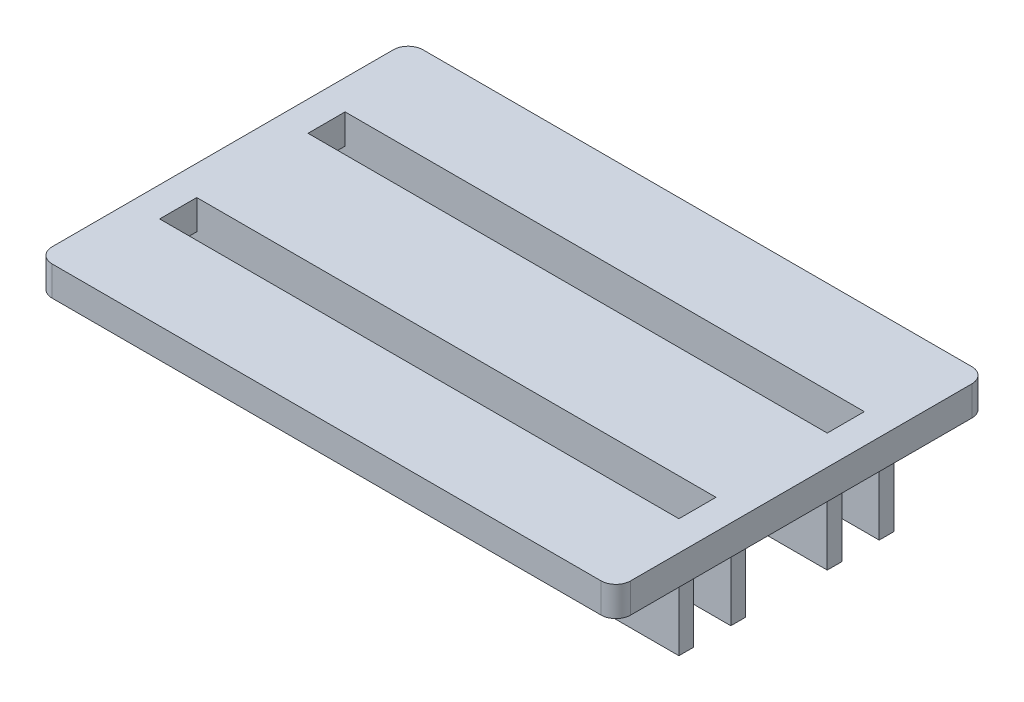
ISO-10303-21;
HEADER;
FILE_DESCRIPTION(('STEP AP214'),'2;1');
FILE_NAME('part.step','',(''),(''),'','','');
FILE_SCHEMA(('AUTOMOTIVE_DESIGN { 1 0 10303 214 1 1 1 1 }'));
ENDSEC;
DATA;
#1=APPLICATION_CONTEXT('core data for automotive mechanical design processes');
#2=APPLICATION_PROTOCOL_DEFINITION('international standard','automotive_design',2000,#1);
#3=PRODUCT_CONTEXT('',#1,'mechanical');
#4=PRODUCT('Part','Part','',(#3));
#5=PRODUCT_RELATED_PRODUCT_CATEGORY('part','',(#4));
#6=PRODUCT_DEFINITION_FORMATION('','',#4);
#7=PRODUCT_DEFINITION_CONTEXT('part definition',#1,'design');
#8=PRODUCT_DEFINITION('design','',#6,#7);
#9=PRODUCT_DEFINITION_SHAPE('','',#8);
#10=(LENGTH_UNIT() NAMED_UNIT(*) SI_UNIT(.MILLI.,.METRE.));
#11=(NAMED_UNIT(*) PLANE_ANGLE_UNIT() SI_UNIT($,.RADIAN.));
#12=(NAMED_UNIT(*) SI_UNIT($,.STERADIAN.) SOLID_ANGLE_UNIT());
#13=UNCERTAINTY_MEASURE_WITH_UNIT(LENGTH_MEASURE(1.E-05),#10,'distance_accuracy_value','');
#14=(GEOMETRIC_REPRESENTATION_CONTEXT(3) GLOBAL_UNCERTAINTY_ASSIGNED_CONTEXT((#13)) GLOBAL_UNIT_ASSIGNED_CONTEXT((#10,
#11,#12)) REPRESENTATION_CONTEXT('',''));
#15=CARTESIAN_POINT('',(0.,0.,0.));
#16=DIRECTION('',(0.,0.,1.));
#17=DIRECTION('',(1.,0.,0.));
#18=AXIS2_PLACEMENT_3D('',#15,#16,#17);
#19=CARTESIAN_POINT('',(46.99,0.,29.21));
#20=DIRECTION('',(0.,1.,0.));
#21=DIRECTION('',(0.,0.,1.));
#22=AXIS2_PLACEMENT_3D('',#19,#20,#21);
#23=PLANE('',#22);
#24=CARTESIAN_POINT('',(46.99,0.,29.21));
#25=DIRECTION('',(0.,1.,0.));
#26=DIRECTION('',(0.,0.,1.));
#27=AXIS2_PLACEMENT_3D('',#24,#25,#26);
#28=CIRCLE('',#27,2.54);
#29=CARTESIAN_POINT('',(46.99,0.,31.75));
#30=VERTEX_POINT('',#29);
#31=CARTESIAN_POINT('',(49.53,0.,29.21));
#32=VERTEX_POINT('',#31);
#33=EDGE_CURVE('E466',#30,#32,#28,.T.);
#34=ORIENTED_EDGE('',*,*,#33,.F.);
#35=DIRECTION('',(1.,0.,0.));
#36=VECTOR('',#35,1.);
#37=CARTESIAN_POINT('',(-46.99,0.,31.75));
#38=LINE('',#37,#36);
#39=CARTESIAN_POINT('',(-46.99,0.,31.75));
#40=VERTEX_POINT('',#39);
#41=EDGE_CURVE('E523',#40,#30,#38,.T.);
#42=ORIENTED_EDGE('',*,*,#41,.F.);
#43=CARTESIAN_POINT('',(-46.99,0.,29.21));
#44=DIRECTION('',(0.,1.,0.));
#45=DIRECTION('',(0.,0.,1.));
#46=AXIS2_PLACEMENT_3D('',#43,#44,#45);
#47=CIRCLE('',#46,2.54);
#48=CARTESIAN_POINT('',(-49.53,0.,29.21));
#49=VERTEX_POINT('',#48);
#50=EDGE_CURVE('E557',#49,#40,#47,.T.);
#51=ORIENTED_EDGE('',*,*,#50,.F.);
#52=DIRECTION('',(0.,0.,1.));
#53=VECTOR('',#52,1.);
#54=CARTESIAN_POINT('',(-49.53,0.,-29.21));
#55=LINE('',#54,#53);
#56=CARTESIAN_POINT('',(-49.53,0.,-29.21));
#57=VERTEX_POINT('',#56);
#58=EDGE_CURVE('E554',#57,#49,#55,.T.);
#59=ORIENTED_EDGE('',*,*,#58,.F.);
#60=CARTESIAN_POINT('',(-46.99,0.,-29.21));
#61=DIRECTION('',(0.,1.,0.));
#62=DIRECTION('',(0.,0.,1.));
#63=AXIS2_PLACEMENT_3D('',#60,#61,#62);
#64=CIRCLE('',#63,2.54);
#65=CARTESIAN_POINT('',(-46.99,0.,-31.75));
#66=VERTEX_POINT('',#65);
#67=EDGE_CURVE('E552',#66,#57,#64,.T.);
#68=ORIENTED_EDGE('',*,*,#67,.F.);
#69=DIRECTION('',(-1.,0.,0.));
#70=VECTOR('',#69,1.);
#71=CARTESIAN_POINT('',(-46.99,0.,-31.75));
#72=LINE('',#71,#70);
#73=CARTESIAN_POINT('',(46.99,0.,-31.75));
#74=VERTEX_POINT('',#73);
#75=EDGE_CURVE('E550',#74,#66,#72,.T.);
#76=ORIENTED_EDGE('',*,*,#75,.F.);
#77=CARTESIAN_POINT('',(46.99,0.,-29.21));
#78=DIRECTION('',(0.,1.,0.));
#79=DIRECTION('',(0.,0.,-1.));
#80=AXIS2_PLACEMENT_3D('',#77,#78,#79);
#81=CIRCLE('',#80,2.54);
#82=CARTESIAN_POINT('',(49.53,0.,-29.21));
#83=VERTEX_POINT('',#82);
#84=EDGE_CURVE('E548',#83,#74,#81,.T.);
#85=ORIENTED_EDGE('',*,*,#84,.F.);
#86=DIRECTION('',(0.,0.,-1.));
#87=VECTOR('',#86,1.);
#88=CARTESIAN_POINT('',(49.53,0.,-29.21));
#89=LINE('',#88,#87);
#90=EDGE_CURVE('E545',#32,#83,#89,.T.);
#91=ORIENTED_EDGE('',*,*,#90,.F.);
#92=EDGE_LOOP('',(#34,#42,#51,#59,#68,#76,#85,#91));
#93=FACE_BOUND('',#92,.T.);
#94=DIRECTION('',(-1.,0.,0.));
#95=VECTOR('',#94,1.);
#96=CARTESIAN_POINT('',(46.99,0.,9.525));
#97=LINE('',#96,#95);
#98=CARTESIAN_POINT('',(46.99,0.,9.525));
#99=VERTEX_POINT('',#98);
#100=CARTESIAN_POINT('',(44.45,0.,9.525));
#101=VERTEX_POINT('',#100);
#102=EDGE_CURVE('E411',#99,#101,#97,.T.);
#103=ORIENTED_EDGE('',*,*,#102,.F.);
#104=DIRECTION('',(0.,0.,1.));
#105=VECTOR('',#104,1.);
#106=CARTESIAN_POINT('',(46.99,0.,6.985));
#107=LINE('',#106,#105);
#108=CARTESIAN_POINT('',(46.99,0.,6.985));
#109=VERTEX_POINT('',#108);
#110=EDGE_CURVE('E374',#109,#99,#107,.T.);
#111=ORIENTED_EDGE('',*,*,#110,.F.);
#112=DIRECTION('',(-1.,0.,0.));
#113=VECTOR('',#112,1.);
#114=CARTESIAN_POINT('',(46.99,0.,6.985));
#115=LINE('',#114,#113);
#116=CARTESIAN_POINT('',(-46.99,0.,6.985));
#117=VERTEX_POINT('',#116);
#118=EDGE_CURVE('E388',#109,#117,#115,.T.);
#119=ORIENTED_EDGE('',*,*,#118,.T.);
#120=DIRECTION('',(0.,0.,1.));
#121=VECTOR('',#120,1.);
#122=CARTESIAN_POINT('',(-46.99,0.,6.985));
#123=LINE('',#122,#121);
#124=CARTESIAN_POINT('',(-46.99,0.,9.525));
#125=VERTEX_POINT('',#124);
#126=EDGE_CURVE('E373',#117,#125,#123,.T.);
#127=ORIENTED_EDGE('',*,*,#126,.T.);
#128=CARTESIAN_POINT('',(-44.45,0.,9.525));
#129=VERTEX_POINT('',#128);
#130=EDGE_CURVE('E410',#129,#125,#97,.T.);
#131=ORIENTED_EDGE('',*,*,#130,.F.);
#132=DIRECTION('',(0.,0.,1.));
#133=VECTOR('',#132,1.);
#134=CARTESIAN_POINT('',(-44.45,0.,15.875));
#135=LINE('',#134,#133);
#136=CARTESIAN_POINT('',(-44.45,0.,15.875));
#137=VERTEX_POINT('',#136);
#138=EDGE_CURVE('E489',#129,#137,#135,.T.);
#139=ORIENTED_EDGE('',*,*,#138,.T.);
#140=DIRECTION('',(-1.,0.,0.));
#141=VECTOR('',#140,1.);
#142=CARTESIAN_POINT('',(46.99,0.,15.875));
#143=LINE('',#142,#141);
#144=CARTESIAN_POINT('',(-46.99,0.,15.875));
#145=VERTEX_POINT('',#144);
#146=EDGE_CURVE('E11',#137,#145,#143,.T.);
#147=ORIENTED_EDGE('',*,*,#146,.T.);
#148=DIRECTION('',(0.,0.,1.));
#149=VECTOR('',#148,1.);
#150=CARTESIAN_POINT('',(-46.99,0.,18.415));
#151=LINE('',#150,#149);
#152=CARTESIAN_POINT('',(-46.99,0.,18.415));
#153=VERTEX_POINT('',#152);
#154=EDGE_CURVE('E415',#145,#153,#151,.T.);
#155=ORIENTED_EDGE('',*,*,#154,.T.);
#156=DIRECTION('',(-1.,0.,0.));
#157=VECTOR('',#156,1.);
#158=CARTESIAN_POINT('',(46.99,0.,18.415));
#159=LINE('',#158,#157);
#160=CARTESIAN_POINT('',(46.99,0.,18.415));
#161=VERTEX_POINT('',#160);
#162=EDGE_CURVE('E450',#161,#153,#159,.T.);
#163=ORIENTED_EDGE('',*,*,#162,.F.);
#164=DIRECTION('',(0.,0.,1.));
#165=VECTOR('',#164,1.);
#166=CARTESIAN_POINT('',(46.99,0.,18.415));
#167=LINE('',#166,#165);
#168=CARTESIAN_POINT('',(46.99,0.,15.875));
#169=VERTEX_POINT('',#168);
#170=EDGE_CURVE('E416',#169,#161,#167,.T.);
#171=ORIENTED_EDGE('',*,*,#170,.F.);
#172=CARTESIAN_POINT('',(44.45,0.,15.875));
#173=VERTEX_POINT('',#172);
#174=EDGE_CURVE('E56',#169,#173,#143,.T.);
#175=ORIENTED_EDGE('',*,*,#174,.T.);
#176=DIRECTION('',(0.,0.,-1.));
#177=VECTOR('',#176,1.);
#178=CARTESIAN_POINT('',(44.45,0.,15.875));
#179=LINE('',#178,#177);
#180=EDGE_CURVE('E483',#173,#101,#179,.T.);
#181=ORIENTED_EDGE('',*,*,#180,.T.);
#182=EDGE_LOOP('',(#103,#111,#119,#127,#131,#139,#147,#155,#163,#171,#175,#181));
#183=FACE_BOUND('',#182,.T.);
#184=DIRECTION('',(-1.,0.,0.));
#185=VECTOR('',#184,1.);
#186=CARTESIAN_POINT('',(46.99,0.,-15.875));
#187=LINE('',#186,#185);
#188=CARTESIAN_POINT('',(46.99,0.,-15.875));
#189=VERTEX_POINT('',#188);
#190=CARTESIAN_POINT('',(44.45,0.,-15.875));
#191=VERTEX_POINT('',#190);
#192=EDGE_CURVE('E63',#189,#191,#187,.T.);
#193=ORIENTED_EDGE('',*,*,#192,.F.);
#194=DIRECTION('',(0.,0.,1.));
#195=VECTOR('',#194,1.);
#196=CARTESIAN_POINT('',(46.99,0.,-18.415));
#197=LINE('',#196,#195);
#198=CARTESIAN_POINT('',(46.99,0.,-18.415));
#199=VERTEX_POINT('',#198);
#200=EDGE_CURVE('E67',#199,#189,#197,.T.);
#201=ORIENTED_EDGE('',*,*,#200,.F.);
#202=DIRECTION('',(-1.,0.,0.));
#203=VECTOR('',#202,1.);
#204=CARTESIAN_POINT('',(46.99,0.,-18.415));
#205=LINE('',#204,#203);
#206=CARTESIAN_POINT('',(-46.99,0.,-18.415));
#207=VERTEX_POINT('',#206);
#208=EDGE_CURVE('E328',#199,#207,#205,.T.);
#209=ORIENTED_EDGE('',*,*,#208,.T.);
#210=DIRECTION('',(0.,0.,1.));
#211=VECTOR('',#210,1.);
#212=CARTESIAN_POINT('',(-46.99,0.,-18.415));
#213=LINE('',#212,#211);
#214=CARTESIAN_POINT('',(-46.99,0.,-15.875));
#215=VERTEX_POINT('',#214);
#216=EDGE_CURVE('E319',#207,#215,#213,.T.);
#217=ORIENTED_EDGE('',*,*,#216,.T.);
#218=CARTESIAN_POINT('',(-44.45,0.,-15.875));
#219=VERTEX_POINT('',#218);
#220=EDGE_CURVE('E304',#219,#215,#187,.T.);
#221=ORIENTED_EDGE('',*,*,#220,.F.);
#222=DIRECTION('',(0.,0.,1.));
#223=VECTOR('',#222,1.);
#224=CARTESIAN_POINT('',(-44.45,0.,-15.875));
#225=LINE('',#224,#223);
#226=CARTESIAN_POINT('',(-44.45,0.,-9.525));
#227=VERTEX_POINT('',#226);
#228=EDGE_CURVE('E455',#219,#227,#225,.T.);
#229=ORIENTED_EDGE('',*,*,#228,.T.);
#230=DIRECTION('',(-1.,0.,0.));
#231=VECTOR('',#230,1.);
#232=CARTESIAN_POINT('',(46.99,0.,-9.525));
#233=LINE('',#232,#231);
#234=CARTESIAN_POINT('',(-46.99,0.,-9.525));
#235=VERTEX_POINT('',#234);
#236=EDGE_CURVE('E361',#227,#235,#233,.T.);
#237=ORIENTED_EDGE('',*,*,#236,.T.);
#238=DIRECTION('',(0.,0.,1.));
#239=VECTOR('',#238,1.);
#240=CARTESIAN_POINT('',(-46.99,0.,-6.985));
#241=LINE('',#240,#239);
#242=CARTESIAN_POINT('',(-46.99,0.,-6.985));
#243=VERTEX_POINT('',#242);
#244=EDGE_CURVE('E337',#235,#243,#241,.T.);
#245=ORIENTED_EDGE('',*,*,#244,.T.);
#246=DIRECTION('',(-1.,0.,0.));
#247=VECTOR('',#246,1.);
#248=CARTESIAN_POINT('',(46.99,0.,-6.985));
#249=LINE('',#248,#247);
#250=CARTESIAN_POINT('',(46.99,0.,-6.985));
#251=VERTEX_POINT('',#250);
#252=EDGE_CURVE('E346',#251,#243,#249,.T.);
#253=ORIENTED_EDGE('',*,*,#252,.F.);
#254=DIRECTION('',(0.,0.,1.));
#255=VECTOR('',#254,1.);
#256=CARTESIAN_POINT('',(46.99,0.,-6.985));
#257=LINE('',#256,#255);
#258=CARTESIAN_POINT('',(46.99,0.,-9.525));
#259=VERTEX_POINT('',#258);
#260=EDGE_CURVE('E342',#259,#251,#257,.T.);
#261=ORIENTED_EDGE('',*,*,#260,.F.);
#262=CARTESIAN_POINT('',(44.45,0.,-9.525));
#263=VERTEX_POINT('',#262);
#264=EDGE_CURVE('E362',#259,#263,#233,.T.);
#265=ORIENTED_EDGE('',*,*,#264,.T.);
#266=DIRECTION('',(0.,0.,-1.));
#267=VECTOR('',#266,1.);
#268=CARTESIAN_POINT('',(44.45,0.,-15.875));
#269=LINE('',#268,#267);
#270=EDGE_CURVE('E460',#263,#191,#269,.T.);
#271=ORIENTED_EDGE('',*,*,#270,.T.);
#272=EDGE_LOOP('',(#193,#201,#209,#217,#221,#229,#237,#245,#253,#261,#265,#271));
#273=FACE_BOUND('',#272,.T.);
#274=ADVANCED_FACE('F45',(#93,#183,#273),#23,.F.);
#275=CARTESIAN_POINT('',(46.99,5.08,29.21));
#276=DIRECTION('',(0.,1.,0.));
#277=DIRECTION('',(0.,0.,1.));
#278=AXIS2_PLACEMENT_3D('',#275,#276,#277);
#279=PLANE('',#278);
#280=CARTESIAN_POINT('',(46.99,5.08,29.21));
#281=DIRECTION('',(0.,1.,0.));
#282=DIRECTION('',(0.,0.,1.));
#283=AXIS2_PLACEMENT_3D('',#280,#281,#282);
#284=CIRCLE('',#283,2.54);
#285=CARTESIAN_POINT('',(46.99,5.08,31.75));
#286=VERTEX_POINT('',#285);
#287=CARTESIAN_POINT('',(49.53,5.08,29.21));
#288=VERTEX_POINT('',#287);
#289=EDGE_CURVE('E518',#286,#288,#284,.T.);
#290=ORIENTED_EDGE('',*,*,#289,.T.);
#291=DIRECTION('',(0.,0.,-1.));
#292=VECTOR('',#291,1.);
#293=CARTESIAN_POINT('',(49.53,5.08,-29.21));
#294=LINE('',#293,#292);
#295=CARTESIAN_POINT('',(49.53,5.08,-29.21));
#296=VERTEX_POINT('',#295);
#297=EDGE_CURVE('E522',#288,#296,#294,.T.);
#298=ORIENTED_EDGE('',*,*,#297,.T.);
#299=CARTESIAN_POINT('',(46.99,5.08,-29.21));
#300=DIRECTION('',(0.,1.,0.));
#301=DIRECTION('',(0.,0.,-1.));
#302=AXIS2_PLACEMENT_3D('',#299,#300,#301);
#303=CIRCLE('',#302,2.54);
#304=CARTESIAN_POINT('',(46.99,5.08,-31.75));
#305=VERTEX_POINT('',#304);
#306=EDGE_CURVE('E526',#296,#305,#303,.T.);
#307=ORIENTED_EDGE('',*,*,#306,.T.);
#308=DIRECTION('',(-1.,0.,0.));
#309=VECTOR('',#308,1.);
#310=CARTESIAN_POINT('',(-46.99,5.08,-31.75));
#311=LINE('',#310,#309);
#312=CARTESIAN_POINT('',(-46.99,5.08,-31.75));
#313=VERTEX_POINT('',#312);
#314=EDGE_CURVE('E528',#305,#313,#311,.T.);
#315=ORIENTED_EDGE('',*,*,#314,.T.);
#316=CARTESIAN_POINT('',(-46.99,5.08,-29.21));
#317=DIRECTION('',(0.,1.,0.));
#318=DIRECTION('',(0.,0.,1.));
#319=AXIS2_PLACEMENT_3D('',#316,#317,#318);
#320=CIRCLE('',#319,2.54);
#321=CARTESIAN_POINT('',(-49.53,5.08,-29.21));
#322=VERTEX_POINT('',#321);
#323=EDGE_CURVE('E531',#313,#322,#320,.T.);
#324=ORIENTED_EDGE('',*,*,#323,.T.);
#325=DIRECTION('',(0.,0.,1.));
#326=VECTOR('',#325,1.);
#327=CARTESIAN_POINT('',(-49.53,5.08,-29.21));
#328=LINE('',#327,#326);
#329=CARTESIAN_POINT('',(-49.53,5.08,29.21));
#330=VERTEX_POINT('',#329);
#331=EDGE_CURVE('E533',#322,#330,#328,.T.);
#332=ORIENTED_EDGE('',*,*,#331,.T.);
#333=CARTESIAN_POINT('',(-46.99,5.08,29.21));
#334=DIRECTION('',(0.,1.,0.));
#335=DIRECTION('',(0.,0.,1.));
#336=AXIS2_PLACEMENT_3D('',#333,#334,#335);
#337=CIRCLE('',#336,2.54);
#338=CARTESIAN_POINT('',(-46.99,5.08,31.75));
#339=VERTEX_POINT('',#338);
#340=EDGE_CURVE('E536',#330,#339,#337,.T.);
#341=ORIENTED_EDGE('',*,*,#340,.T.);
#342=DIRECTION('',(1.,0.,0.));
#343=VECTOR('',#342,1.);
#344=CARTESIAN_POINT('',(-46.99,5.08,31.75));
#345=LINE('',#344,#343);
#346=EDGE_CURVE('E539',#339,#286,#345,.T.);
#347=ORIENTED_EDGE('',*,*,#346,.T.);
#348=EDGE_LOOP('',(#290,#298,#307,#315,#324,#332,#341,#347));
#349=FACE_BOUND('',#348,.T.);
#350=DIRECTION('',(1.,0.,0.));
#351=VECTOR('',#350,1.);
#352=CARTESIAN_POINT('',(-44.45,5.08,15.875));
#353=LINE('',#352,#351);
#354=CARTESIAN_POINT('',(-44.45,5.08,15.875));
#355=VERTEX_POINT('',#354);
#356=CARTESIAN_POINT('',(44.45,5.08,15.875));
#357=VERTEX_POINT('',#356);
#358=EDGE_CURVE('E496',#355,#357,#353,.T.);
#359=ORIENTED_EDGE('',*,*,#358,.F.);
#360=DIRECTION('',(0.,0.,1.));
#361=VECTOR('',#360,1.);
#362=CARTESIAN_POINT('',(-44.45,5.08,15.875));
#363=LINE('',#362,#361);
#364=CARTESIAN_POINT('',(-44.45,5.08,9.525));
#365=VERTEX_POINT('',#364);
#366=EDGE_CURVE('E500',#365,#355,#363,.T.);
#367=ORIENTED_EDGE('',*,*,#366,.F.);
#368=DIRECTION('',(-1.,0.,0.));
#369=VECTOR('',#368,1.);
#370=CARTESIAN_POINT('',(-44.45,5.08,9.525));
#371=LINE('',#370,#369);
#372=CARTESIAN_POINT('',(44.45,5.08,9.525));
#373=VERTEX_POINT('',#372);
#374=EDGE_CURVE('E504',#373,#365,#371,.T.);
#375=ORIENTED_EDGE('',*,*,#374,.F.);
#376=DIRECTION('',(0.,0.,-1.));
#377=VECTOR('',#376,1.);
#378=CARTESIAN_POINT('',(44.45,5.08,15.875));
#379=LINE('',#378,#377);
#380=EDGE_CURVE('E482',#357,#373,#379,.T.);
#381=ORIENTED_EDGE('',*,*,#380,.F.);
#382=EDGE_LOOP('',(#359,#367,#375,#381));
#383=FACE_BOUND('',#382,.T.);
#384=DIRECTION('',(-1.,0.,0.));
#385=VECTOR('',#384,1.);
#386=CARTESIAN_POINT('',(-44.45,5.08,-15.875));
#387=LINE('',#386,#385);
#388=CARTESIAN_POINT('',(44.45,5.08,-15.875));
#389=VERTEX_POINT('',#388);
#390=CARTESIAN_POINT('',(-44.45,5.08,-15.875));
#391=VERTEX_POINT('',#390);
#392=EDGE_CURVE('E467',#389,#391,#387,.T.);
#393=ORIENTED_EDGE('',*,*,#392,.F.);
#394=DIRECTION('',(0.,0.,-1.));
#395=VECTOR('',#394,1.);
#396=CARTESIAN_POINT('',(44.45,5.08,-15.875));
#397=LINE('',#396,#395);
#398=CARTESIAN_POINT('',(44.45,5.08,-9.525));
#399=VERTEX_POINT('',#398);
#400=EDGE_CURVE('E470',#399,#389,#397,.T.);
#401=ORIENTED_EDGE('',*,*,#400,.F.);
#402=DIRECTION('',(1.,0.,0.));
#403=VECTOR('',#402,1.);
#404=CARTESIAN_POINT('',(-44.45,5.08,-9.525));
#405=LINE('',#404,#403);
#406=CARTESIAN_POINT('',(-44.45,5.08,-9.525));
#407=VERTEX_POINT('',#406);
#408=EDGE_CURVE('E473',#407,#399,#405,.T.);
#409=ORIENTED_EDGE('',*,*,#408,.F.);
#410=DIRECTION('',(0.,0.,1.));
#411=VECTOR('',#410,1.);
#412=CARTESIAN_POINT('',(-44.45,5.08,-15.875));
#413=LINE('',#412,#411);
#414=EDGE_CURVE('E464',#391,#407,#413,.T.);
#415=ORIENTED_EDGE('',*,*,#414,.F.);
#416=EDGE_LOOP('',(#393,#401,#409,#415));
#417=FACE_BOUND('',#416,.T.);
#418=ADVANCED_FACE('F610',(#349,#383,#417),#279,.T.);
#419=CARTESIAN_POINT('',(46.99,5.08,29.21));
#420=DIRECTION('',(0.,-1.,0.));
#421=DIRECTION('',(0.,0.,-1.));
#422=AXIS2_PLACEMENT_3D('',#419,#420,#421);
#423=CYLINDRICAL_SURFACE('',#422,2.54);
#424=ORIENTED_EDGE('',*,*,#33,.T.);
#425=DIRECTION('',(0.,-1.,0.));
#426=VECTOR('',#425,1.);
#427=CARTESIAN_POINT('',(49.53,5.08,29.21));
#428=LINE('',#427,#426);
#429=EDGE_CURVE('E49',#288,#32,#428,.T.);
#430=ORIENTED_EDGE('',*,*,#429,.F.);
#431=ORIENTED_EDGE('',*,*,#289,.F.);
#432=DIRECTION('',(0.,-1.,0.));
#433=VECTOR('',#432,1.);
#434=CARTESIAN_POINT('',(46.99,5.08,31.75));
#435=LINE('',#434,#433);
#436=EDGE_CURVE('E542',#286,#30,#435,.T.);
#437=ORIENTED_EDGE('',*,*,#436,.T.);
#438=EDGE_LOOP('',(#424,#430,#431,#437));
#439=FACE_BOUND('',#438,.T.);
#440=ADVANCED_FACE('F47',(#439),#423,.T.);
#441=CARTESIAN_POINT('',(49.53,5.08,-29.21));
#442=DIRECTION('',(-1.,0.,0.));
#443=DIRECTION('',(0.,0.,1.));
#444=AXIS2_PLACEMENT_3D('',#441,#442,#443);
#445=PLANE('',#444);
#446=ORIENTED_EDGE('',*,*,#90,.T.);
#447=DIRECTION('',(0.,-1.,0.));
#448=VECTOR('',#447,1.);
#449=CARTESIAN_POINT('',(49.53,5.08,-29.21));
#450=LINE('',#449,#448);
#451=EDGE_CURVE('E581',#296,#83,#450,.T.);
#452=ORIENTED_EDGE('',*,*,#451,.F.);
#453=ORIENTED_EDGE('',*,*,#297,.F.);
#454=ORIENTED_EDGE('',*,*,#429,.T.);
#455=EDGE_LOOP('',(#446,#452,#453,#454));
#456=FACE_BOUND('',#455,.T.);
#457=ADVANCED_FACE('F591',(#456),#445,.F.);
#458=CARTESIAN_POINT('',(46.99,5.08,-29.21));
#459=DIRECTION('',(0.,-1.,0.));
#460=DIRECTION('',(0.,0.,-1.));
#461=AXIS2_PLACEMENT_3D('',#458,#459,#460);
#462=CYLINDRICAL_SURFACE('',#461,2.54);
#463=ORIENTED_EDGE('',*,*,#84,.T.);
#464=DIRECTION('',(0.,-1.,0.));
#465=VECTOR('',#464,1.);
#466=CARTESIAN_POINT('',(46.99,5.08,-31.75));
#467=LINE('',#466,#465);
#468=EDGE_CURVE('E579',#305,#74,#467,.T.);
#469=ORIENTED_EDGE('',*,*,#468,.F.);
#470=ORIENTED_EDGE('',*,*,#306,.F.);
#471=ORIENTED_EDGE('',*,*,#451,.T.);
#472=EDGE_LOOP('',(#463,#469,#470,#471));
#473=FACE_BOUND('',#472,.T.);
#474=ADVANCED_FACE('F603',(#473),#462,.T.);
#475=CARTESIAN_POINT('',(-46.99,5.08,-31.75));
#476=DIRECTION('',(0.,0.,1.));
#477=DIRECTION('',(1.,0.,0.));
#478=AXIS2_PLACEMENT_3D('',#475,#476,#477);
#479=PLANE('',#478);
#480=ORIENTED_EDGE('',*,*,#75,.T.);
#481=DIRECTION('',(0.,-1.,0.));
#482=VECTOR('',#481,1.);
#483=CARTESIAN_POINT('',(-46.99,5.08,-31.75));
#484=LINE('',#483,#482);
#485=EDGE_CURVE('E576',#313,#66,#484,.T.);
#486=ORIENTED_EDGE('',*,*,#485,.F.);
#487=ORIENTED_EDGE('',*,*,#314,.F.);
#488=ORIENTED_EDGE('',*,*,#468,.T.);
#489=EDGE_LOOP('',(#480,#486,#487,#488));
#490=FACE_BOUND('',#489,.T.);
#491=ADVANCED_FACE('F606',(#490),#479,.F.);
#492=CARTESIAN_POINT('',(-46.99,5.08,-29.21));
#493=DIRECTION('',(0.,-1.,0.));
#494=DIRECTION('',(0.,0.,-1.));
#495=AXIS2_PLACEMENT_3D('',#492,#493,#494);
#496=CYLINDRICAL_SURFACE('',#495,2.54);
#497=ORIENTED_EDGE('',*,*,#67,.T.);
#498=DIRECTION('',(0.,-1.,0.));
#499=VECTOR('',#498,1.);
#500=CARTESIAN_POINT('',(-49.53,5.08,-29.21));
#501=LINE('',#500,#499);
#502=EDGE_CURVE('E573',#322,#57,#501,.T.);
#503=ORIENTED_EDGE('',*,*,#502,.F.);
#504=ORIENTED_EDGE('',*,*,#323,.F.);
#505=ORIENTED_EDGE('',*,*,#485,.T.);
#506=EDGE_LOOP('',(#497,#503,#504,#505));
#507=FACE_BOUND('',#506,.T.);
#508=ADVANCED_FACE('F626',(#507),#496,.T.);
#509=CARTESIAN_POINT('',(-49.53,5.08,-29.21));
#510=DIRECTION('',(1.,0.,0.));
#511=DIRECTION('',(0.,0.,-1.));
#512=AXIS2_PLACEMENT_3D('',#509,#510,#511);
#513=PLANE('',#512);
#514=ORIENTED_EDGE('',*,*,#58,.T.);
#515=DIRECTION('',(0.,-1.,0.));
#516=VECTOR('',#515,1.);
#517=CARTESIAN_POINT('',(-49.53,5.08,29.21));
#518=LINE('',#517,#516);
#519=EDGE_CURVE('E569',#330,#49,#518,.T.);
#520=ORIENTED_EDGE('',*,*,#519,.F.);
#521=ORIENTED_EDGE('',*,*,#331,.F.);
#522=ORIENTED_EDGE('',*,*,#502,.T.);
#523=EDGE_LOOP('',(#514,#520,#521,#522));
#524=FACE_BOUND('',#523,.T.);
#525=ADVANCED_FACE('F623',(#524),#513,.F.);
#526=CARTESIAN_POINT('',(-46.99,5.08,29.21));
#527=DIRECTION('',(0.,-1.,0.));
#528=DIRECTION('',(0.,0.,-1.));
#529=AXIS2_PLACEMENT_3D('',#526,#527,#528);
#530=CYLINDRICAL_SURFACE('',#529,2.54);
#531=ORIENTED_EDGE('',*,*,#50,.T.);
#532=DIRECTION('',(0.,-1.,0.));
#533=VECTOR('',#532,1.);
#534=CARTESIAN_POINT('',(-46.99,5.08,31.75));
#535=LINE('',#534,#533);
#536=EDGE_CURVE('E565',#339,#40,#535,.T.);
#537=ORIENTED_EDGE('',*,*,#536,.F.);
#538=ORIENTED_EDGE('',*,*,#340,.F.);
#539=ORIENTED_EDGE('',*,*,#519,.T.);
#540=EDGE_LOOP('',(#531,#537,#538,#539));
#541=FACE_BOUND('',#540,.T.);
#542=ADVANCED_FACE('F619',(#541),#530,.T.);
#543=CARTESIAN_POINT('',(-46.99,5.08,31.75));
#544=DIRECTION('',(0.,0.,-1.));
#545=DIRECTION('',(-1.,0.,0.));
#546=AXIS2_PLACEMENT_3D('',#543,#544,#545);
#547=PLANE('',#546);
#548=ORIENTED_EDGE('',*,*,#41,.T.);
#549=ORIENTED_EDGE('',*,*,#436,.F.);
#550=ORIENTED_EDGE('',*,*,#346,.F.);
#551=ORIENTED_EDGE('',*,*,#536,.T.);
#552=EDGE_LOOP('',(#548,#549,#550,#551));
#553=FACE_BOUND('',#552,.T.);
#554=ADVANCED_FACE('F617',(#553),#547,.F.);
#555=CARTESIAN_POINT('',(-44.45,94.2064971823756,15.875));
#556=DIRECTION('',(1.,0.,0.));
#557=DIRECTION('',(0.,0.,-1.));
#558=AXIS2_PLACEMENT_3D('',#555,#556,#557);
#559=PLANE('',#558);
#560=ORIENTED_EDGE('',*,*,#366,.T.);
#561=DIRECTION('',(0.,-1.,0.));
#562=VECTOR('',#561,1.);
#563=CARTESIAN_POINT('',(-44.45,94.2064971823756,15.875));
#564=LINE('',#563,#562);
#565=EDGE_CURVE('E493',#355,#137,#564,.T.);
#566=ORIENTED_EDGE('',*,*,#565,.T.);
#567=ORIENTED_EDGE('',*,*,#138,.F.);
#568=DIRECTION('',(0.,-1.,0.));
#569=VECTOR('',#568,1.);
#570=CARTESIAN_POINT('',(-44.45,94.2064971823756,9.525));
#571=LINE('',#570,#569);
#572=EDGE_CURVE('E454',#365,#129,#571,.T.);
#573=ORIENTED_EDGE('',*,*,#572,.F.);
#574=EDGE_LOOP('',(#560,#566,#567,#573));
#575=FACE_BOUND('',#574,.T.);
#576=ADVANCED_FACE('F645',(#575),#559,.T.);
#577=CARTESIAN_POINT('',(-44.45,94.2064971823756,15.875));
#578=DIRECTION('',(0.,0.,-1.));
#579=DIRECTION('',(-1.,0.,0.));
#580=AXIS2_PLACEMENT_3D('',#577,#578,#579);
#581=PLANE('',#580);
#582=ORIENTED_EDGE('',*,*,#358,.T.);
#583=DIRECTION('',(0.,-1.,0.));
#584=VECTOR('',#583,1.);
#585=CARTESIAN_POINT('',(44.45,94.2064971823756,15.875));
#586=LINE('',#585,#584);
#587=EDGE_CURVE('E488',#357,#173,#586,.T.);
#588=ORIENTED_EDGE('',*,*,#587,.T.);
#589=ORIENTED_EDGE('',*,*,#174,.F.);
#590=DIRECTION('',(0.,1.,0.));
#591=VECTOR('',#590,1.);
#592=CARTESIAN_POINT('',(46.99,0.,15.875));
#593=LINE('',#592,#591);
#594=CARTESIAN_POINT('',(46.99,-12.7,15.875));
#595=VERTEX_POINT('',#594);
#596=EDGE_CURVE('E426',#595,#169,#593,.T.);
#597=ORIENTED_EDGE('',*,*,#596,.F.);
#598=DIRECTION('',(-1.,0.,0.));
#599=VECTOR('',#598,1.);
#600=CARTESIAN_POINT('',(46.99,-12.7,15.875));
#601=LINE('',#600,#599);
#602=CARTESIAN_POINT('',(-46.99,-12.7,15.875));
#603=VERTEX_POINT('',#602);
#604=EDGE_CURVE('E442',#595,#603,#601,.T.);
#605=ORIENTED_EDGE('',*,*,#604,.T.);
#606=DIRECTION('',(0.,1.,0.));
#607=VECTOR('',#606,1.);
#608=CARTESIAN_POINT('',(-46.99,0.,15.875));
#609=LINE('',#608,#607);
#610=EDGE_CURVE('E421',#603,#145,#609,.T.);
#611=ORIENTED_EDGE('',*,*,#610,.T.);
#612=ORIENTED_EDGE('',*,*,#146,.F.);
#613=ORIENTED_EDGE('',*,*,#565,.F.);
#614=EDGE_LOOP('',(#582,#588,#589,#597,#605,#611,#612,#613));
#615=FACE_BOUND('',#614,.T.);
#616=ADVANCED_FACE('F663',(#615),#581,.T.);
#617=CARTESIAN_POINT('',(44.45,94.2064971823756,15.875));
#618=DIRECTION('',(-1.,0.,0.));
#619=DIRECTION('',(0.,0.,1.));
#620=AXIS2_PLACEMENT_3D('',#617,#618,#619);
#621=PLANE('',#620);
#622=ORIENTED_EDGE('',*,*,#380,.T.);
#623=DIRECTION('',(0.,-1.,0.));
#624=VECTOR('',#623,1.);
#625=CARTESIAN_POINT('',(44.45,94.2064971823756,9.525));
#626=LINE('',#625,#624);
#627=EDGE_CURVE('E487',#373,#101,#626,.T.);
#628=ORIENTED_EDGE('',*,*,#627,.T.);
#629=ORIENTED_EDGE('',*,*,#180,.F.);
#630=ORIENTED_EDGE('',*,*,#587,.F.);
#631=EDGE_LOOP('',(#622,#628,#629,#630));
#632=FACE_BOUND('',#631,.T.);
#633=ADVANCED_FACE('F671',(#632),#621,.T.);
#634=CARTESIAN_POINT('',(-44.45,94.2064971823756,9.525));
#635=DIRECTION('',(0.,0.,1.));
#636=DIRECTION('',(1.,0.,0.));
#637=AXIS2_PLACEMENT_3D('',#634,#635,#636);
#638=PLANE('',#637);
#639=ORIENTED_EDGE('',*,*,#374,.T.);
#640=ORIENTED_EDGE('',*,*,#572,.T.);
#641=ORIENTED_EDGE('',*,*,#130,.T.);
#642=DIRECTION('',(0.,-1.,0.));
#643=VECTOR('',#642,1.);
#644=CARTESIAN_POINT('',(-46.99,0.,9.525));
#645=LINE('',#644,#643);
#646=CARTESIAN_POINT('',(-46.99,-12.7,9.525));
#647=VERTEX_POINT('',#646);
#648=EDGE_CURVE('E391',#125,#647,#645,.T.);
#649=ORIENTED_EDGE('',*,*,#648,.T.);
#650=DIRECTION('',(-1.,0.,0.));
#651=VECTOR('',#650,1.);
#652=CARTESIAN_POINT('',(46.99,-12.7,9.525));
#653=LINE('',#652,#651);
#654=CARTESIAN_POINT('',(46.99,-12.7,9.525));
#655=VERTEX_POINT('',#654);
#656=EDGE_CURVE('E406',#655,#647,#653,.T.);
#657=ORIENTED_EDGE('',*,*,#656,.F.);
#658=DIRECTION('',(0.,-1.,0.));
#659=VECTOR('',#658,1.);
#660=CARTESIAN_POINT('',(46.99,0.,9.525));
#661=LINE('',#660,#659);
#662=EDGE_CURVE('E378',#99,#655,#661,.T.);
#663=ORIENTED_EDGE('',*,*,#662,.F.);
#664=ORIENTED_EDGE('',*,*,#102,.T.);
#665=ORIENTED_EDGE('',*,*,#627,.F.);
#666=EDGE_LOOP('',(#639,#640,#641,#649,#657,#663,#664,#665));
#667=FACE_BOUND('',#666,.T.);
#668=ADVANCED_FACE('F678',(#667),#638,.T.);
#669=CARTESIAN_POINT('',(44.45,94.2064971823756,-15.875));
#670=DIRECTION('',(-1.,0.,0.));
#671=DIRECTION('',(0.,0.,1.));
#672=AXIS2_PLACEMENT_3D('',#669,#670,#671);
#673=PLANE('',#672);
#674=ORIENTED_EDGE('',*,*,#400,.T.);
#675=DIRECTION('',(0.,-1.,0.));
#676=VECTOR('',#675,1.);
#677=CARTESIAN_POINT('',(44.45,94.2064971823756,-15.875));
#678=LINE('',#677,#676);
#679=EDGE_CURVE('E462',#389,#191,#678,.T.);
#680=ORIENTED_EDGE('',*,*,#679,.T.);
#681=ORIENTED_EDGE('',*,*,#270,.F.);
#682=DIRECTION('',(0.,-1.,0.));
#683=VECTOR('',#682,1.);
#684=CARTESIAN_POINT('',(44.45,94.2064971823756,-9.525));
#685=LINE('',#684,#683);
#686=EDGE_CURVE('E463',#399,#263,#685,.T.);
#687=ORIENTED_EDGE('',*,*,#686,.F.);
#688=EDGE_LOOP('',(#674,#680,#681,#687));
#689=FACE_BOUND('',#688,.T.);
#690=ADVANCED_FACE('F687',(#689),#673,.T.);
#691=CARTESIAN_POINT('',(-44.45,94.2064971823756,-15.875));
#692=DIRECTION('',(0.,0.,1.));
#693=DIRECTION('',(1.,0.,0.));
#694=AXIS2_PLACEMENT_3D('',#691,#692,#693);
#695=PLANE('',#694);
#696=ORIENTED_EDGE('',*,*,#392,.T.);
#697=DIRECTION('',(0.,-1.,0.));
#698=VECTOR('',#697,1.);
#699=CARTESIAN_POINT('',(-44.45,94.2064971823756,-15.875));
#700=LINE('',#699,#698);
#701=EDGE_CURVE('E459',#391,#219,#700,.T.);
#702=ORIENTED_EDGE('',*,*,#701,.T.);
#703=ORIENTED_EDGE('',*,*,#220,.T.);
#704=DIRECTION('',(0.,-1.,0.));
#705=VECTOR('',#704,1.);
#706=CARTESIAN_POINT('',(-46.99,0.,-15.875));
#707=LINE('',#706,#705);
#708=CARTESIAN_POINT('',(-46.99,-12.7,-15.875));
#709=VERTEX_POINT('',#708);
#710=EDGE_CURVE('E300',#215,#709,#707,.T.);
#711=ORIENTED_EDGE('',*,*,#710,.T.);
#712=DIRECTION('',(-1.,0.,0.));
#713=VECTOR('',#712,1.);
#714=CARTESIAN_POINT('',(46.99,-12.7,-15.875));
#715=LINE('',#714,#713);
#716=CARTESIAN_POINT('',(46.99,-12.7,-15.875));
#717=VERTEX_POINT('',#716);
#718=EDGE_CURVE('E295',#717,#709,#715,.T.);
#719=ORIENTED_EDGE('',*,*,#718,.F.);
#720=DIRECTION('',(0.,-1.,0.));
#721=VECTOR('',#720,1.);
#722=CARTESIAN_POINT('',(46.99,0.,-15.875));
#723=LINE('',#722,#721);
#724=EDGE_CURVE('E285',#189,#717,#723,.T.);
#725=ORIENTED_EDGE('',*,*,#724,.F.);
#726=ORIENTED_EDGE('',*,*,#192,.T.);
#727=ORIENTED_EDGE('',*,*,#679,.F.);
#728=EDGE_LOOP('',(#696,#702,#703,#711,#719,#725,#726,#727));
#729=FACE_BOUND('',#728,.T.);
#730=ADVANCED_FACE('F297',(#729),#695,.T.);
#731=CARTESIAN_POINT('',(-44.45,94.2064971823756,-15.875));
#732=DIRECTION('',(1.,0.,0.));
#733=DIRECTION('',(0.,0.,-1.));
#734=AXIS2_PLACEMENT_3D('',#731,#732,#733);
#735=PLANE('',#734);
#736=ORIENTED_EDGE('',*,*,#414,.T.);
#737=DIRECTION('',(0.,-1.,0.));
#738=VECTOR('',#737,1.);
#739=CARTESIAN_POINT('',(-44.45,94.2064971823756,-9.525));
#740=LINE('',#739,#738);
#741=EDGE_CURVE('E458',#407,#227,#740,.T.);
#742=ORIENTED_EDGE('',*,*,#741,.T.);
#743=ORIENTED_EDGE('',*,*,#228,.F.);
#744=ORIENTED_EDGE('',*,*,#701,.F.);
#745=EDGE_LOOP('',(#736,#742,#743,#744));
#746=FACE_BOUND('',#745,.T.);
#747=ADVANCED_FACE('F701',(#746),#735,.T.);
#748=CARTESIAN_POINT('',(-44.45,94.2064971823756,-9.525));
#749=DIRECTION('',(0.,0.,-1.));
#750=DIRECTION('',(-1.,0.,0.));
#751=AXIS2_PLACEMENT_3D('',#748,#749,#750);
#752=PLANE('',#751);
#753=ORIENTED_EDGE('',*,*,#408,.T.);
#754=ORIENTED_EDGE('',*,*,#686,.T.);
#755=ORIENTED_EDGE('',*,*,#264,.F.);
#756=DIRECTION('',(0.,1.,0.));
#757=VECTOR('',#756,1.);
#758=CARTESIAN_POINT('',(46.99,0.,-9.525));
#759=LINE('',#758,#757);
#760=CARTESIAN_POINT('',(46.99,-12.7,-9.525));
#761=VERTEX_POINT('',#760);
#762=EDGE_CURVE('E339',#761,#259,#759,.T.);
#763=ORIENTED_EDGE('',*,*,#762,.F.);
#764=DIRECTION('',(-1.,0.,0.));
#765=VECTOR('',#764,1.);
#766=CARTESIAN_POINT('',(46.99,-12.7,-9.525));
#767=LINE('',#766,#765);
#768=CARTESIAN_POINT('',(-46.99,-12.7,-9.525));
#769=VERTEX_POINT('',#768);
#770=EDGE_CURVE('E365',#761,#769,#767,.T.);
#771=ORIENTED_EDGE('',*,*,#770,.T.);
#772=DIRECTION('',(0.,1.,0.));
#773=VECTOR('',#772,1.);
#774=CARTESIAN_POINT('',(-46.99,0.,-9.525));
#775=LINE('',#774,#773);
#776=EDGE_CURVE('E353',#769,#235,#775,.T.);
#777=ORIENTED_EDGE('',*,*,#776,.T.);
#778=ORIENTED_EDGE('',*,*,#236,.F.);
#779=ORIENTED_EDGE('',*,*,#741,.F.);
#780=EDGE_LOOP('',(#753,#754,#755,#763,#771,#777,#778,#779));
#781=FACE_BOUND('',#780,.T.);
#782=ADVANCED_FACE('F707',(#781),#752,.T.);
#783=CARTESIAN_POINT('',(46.99,-12.7,18.415));
#784=DIRECTION('',(0.,0.,-1.));
#785=DIRECTION('',(-1.,0.,0.));
#786=AXIS2_PLACEMENT_3D('',#783,#784,#785);
#787=PLANE('',#786);
#788=DIRECTION('',(0.,-1.,0.));
#789=VECTOR('',#788,1.);
#790=CARTESIAN_POINT('',(-46.99,-12.7,18.415));
#791=LINE('',#790,#789);
#792=CARTESIAN_POINT('',(-46.99,-12.7,18.415));
#793=VERTEX_POINT('',#792);
#794=EDGE_CURVE('E432',#153,#793,#791,.T.);
#795=ORIENTED_EDGE('',*,*,#794,.T.);
#796=DIRECTION('',(-1.,0.,0.));
#797=VECTOR('',#796,1.);
#798=CARTESIAN_POINT('',(46.99,-12.7,18.415));
#799=LINE('',#798,#797);
#800=CARTESIAN_POINT('',(46.99,-12.7,18.415));
#801=VERTEX_POINT('',#800);
#802=EDGE_CURVE('E446',#801,#793,#799,.T.);
#803=ORIENTED_EDGE('',*,*,#802,.F.);
#804=DIRECTION('',(0.,-1.,0.));
#805=VECTOR('',#804,1.);
#806=CARTESIAN_POINT('',(46.99,-12.7,18.415));
#807=LINE('',#806,#805);
#808=EDGE_CURVE('E420',#161,#801,#807,.T.);
#809=ORIENTED_EDGE('',*,*,#808,.F.);
#810=ORIENTED_EDGE('',*,*,#162,.T.);
#811=EDGE_LOOP('',(#795,#803,#809,#810));
#812=FACE_BOUND('',#811,.T.);
#813=ADVANCED_FACE('F715',(#812),#787,.F.);
#814=CARTESIAN_POINT('',(46.99,-12.7,15.875));
#815=DIRECTION('',(0.,1.,0.));
#816=DIRECTION('',(0.,0.,1.));
#817=AXIS2_PLACEMENT_3D('',#814,#815,#816);
#818=PLANE('',#817);
#819=DIRECTION('',(0.,0.,-1.));
#820=VECTOR('',#819,1.);
#821=CARTESIAN_POINT('',(-46.99,-12.7,15.875));
#822=LINE('',#821,#820);
#823=EDGE_CURVE('E435',#793,#603,#822,.T.);
#824=ORIENTED_EDGE('',*,*,#823,.T.);
#825=ORIENTED_EDGE('',*,*,#604,.F.);
#826=DIRECTION('',(0.,0.,-1.));
#827=VECTOR('',#826,1.);
#828=CARTESIAN_POINT('',(46.99,-12.7,15.875));
#829=LINE('',#828,#827);
#830=EDGE_CURVE('E424',#801,#595,#829,.T.);
#831=ORIENTED_EDGE('',*,*,#830,.F.);
#832=ORIENTED_EDGE('',*,*,#802,.T.);
#833=EDGE_LOOP('',(#824,#825,#831,#832));
#834=FACE_BOUND('',#833,.T.);
#835=ADVANCED_FACE('F721',(#834),#818,.F.);
#836=CARTESIAN_POINT('',(46.99,0.,0.));
#837=DIRECTION('',(-1.,0.,0.));
#838=DIRECTION('',(0.,0.,1.));
#839=AXIS2_PLACEMENT_3D('',#836,#837,#838);
#840=PLANE('',#839);
#841=ORIENTED_EDGE('',*,*,#170,.T.);
#842=ORIENTED_EDGE('',*,*,#808,.T.);
#843=ORIENTED_EDGE('',*,*,#830,.T.);
#844=ORIENTED_EDGE('',*,*,#596,.T.);
#845=EDGE_LOOP('',(#841,#842,#843,#844));
#846=FACE_BOUND('',#845,.T.);
#847=ADVANCED_FACE('F730',(#846),#840,.F.);
#848=CARTESIAN_POINT('',(-46.99,0.,0.));
#849=DIRECTION('',(-1.,0.,0.));
#850=DIRECTION('',(0.,0.,1.));
#851=AXIS2_PLACEMENT_3D('',#848,#849,#850);
#852=PLANE('',#851);
#853=ORIENTED_EDGE('',*,*,#154,.F.);
#854=ORIENTED_EDGE('',*,*,#610,.F.);
#855=ORIENTED_EDGE('',*,*,#823,.F.);
#856=ORIENTED_EDGE('',*,*,#794,.F.);
#857=EDGE_LOOP('',(#853,#854,#855,#856));
#858=FACE_BOUND('',#857,.T.);
#859=ADVANCED_FACE('F738',(#858),#852,.T.);
#860=CARTESIAN_POINT('',(46.99,-12.7,9.525));
#861=DIRECTION('',(0.,1.,0.));
#862=DIRECTION('',(0.,0.,1.));
#863=AXIS2_PLACEMENT_3D('',#860,#861,#862);
#864=PLANE('',#863);
#865=DIRECTION('',(0.,0.,-1.));
#866=VECTOR('',#865,1.);
#867=CARTESIAN_POINT('',(-46.99,-12.7,9.525));
#868=LINE('',#867,#866);
#869=CARTESIAN_POINT('',(-46.99,-12.7,6.98499999999999));
#870=VERTEX_POINT('',#869);
#871=EDGE_CURVE('E394',#647,#870,#868,.T.);
#872=ORIENTED_EDGE('',*,*,#871,.T.);
#873=DIRECTION('',(-1.,0.,0.));
#874=VECTOR('',#873,1.);
#875=CARTESIAN_POINT('',(46.99,-12.7,6.98499999999999));
#876=LINE('',#875,#874);
#877=CARTESIAN_POINT('',(46.99,-12.7,6.98499999999999));
#878=VERTEX_POINT('',#877);
#879=EDGE_CURVE('E402',#878,#870,#876,.T.);
#880=ORIENTED_EDGE('',*,*,#879,.F.);
#881=DIRECTION('',(0.,0.,-1.));
#882=VECTOR('',#881,1.);
#883=CARTESIAN_POINT('',(46.99,-12.7,9.525));
#884=LINE('',#883,#882);
#885=EDGE_CURVE('E382',#655,#878,#884,.T.);
#886=ORIENTED_EDGE('',*,*,#885,.F.);
#887=ORIENTED_EDGE('',*,*,#656,.T.);
#888=EDGE_LOOP('',(#872,#880,#886,#887));
#889=FACE_BOUND('',#888,.T.);
#890=ADVANCED_FACE('F746',(#889),#864,.F.);
#891=CARTESIAN_POINT('',(46.99,-12.7,6.98499999999999));
#892=DIRECTION('',(0.,0.,1.));
#893=DIRECTION('',(0.,-1.,0.));
#894=AXIS2_PLACEMENT_3D('',#891,#892,#893);
#895=PLANE('',#894);
#896=DIRECTION('',(0.,1.,0.));
#897=VECTOR('',#896,1.);
#898=CARTESIAN_POINT('',(-46.99,-12.7,6.98499999999999));
#899=LINE('',#898,#897);
#900=EDGE_CURVE('E379',#870,#117,#899,.T.);
#901=ORIENTED_EDGE('',*,*,#900,.T.);
#902=ORIENTED_EDGE('',*,*,#118,.F.);
#903=DIRECTION('',(0.,1.,0.));
#904=VECTOR('',#903,1.);
#905=CARTESIAN_POINT('',(46.99,-12.7,6.98499999999999));
#906=LINE('',#905,#904);
#907=EDGE_CURVE('E384',#878,#109,#906,.T.);
#908=ORIENTED_EDGE('',*,*,#907,.F.);
#909=ORIENTED_EDGE('',*,*,#879,.T.);
#910=EDGE_LOOP('',(#901,#902,#908,#909));
#911=FACE_BOUND('',#910,.T.);
#912=ADVANCED_FACE('F755',(#911),#895,.F.);
#913=CARTESIAN_POINT('',(46.99,0.,0.));
#914=DIRECTION('',(1.,0.,0.));
#915=DIRECTION('',(0.,0.,-1.));
#916=AXIS2_PLACEMENT_3D('',#913,#914,#915);
#917=PLANE('',#916);
#918=ORIENTED_EDGE('',*,*,#110,.T.);
#919=ORIENTED_EDGE('',*,*,#662,.T.);
#920=ORIENTED_EDGE('',*,*,#885,.T.);
#921=ORIENTED_EDGE('',*,*,#907,.T.);
#922=EDGE_LOOP('',(#918,#919,#920,#921));
#923=FACE_BOUND('',#922,.T.);
#924=ADVANCED_FACE('F761',(#923),#917,.T.);
#925=CARTESIAN_POINT('',(-46.99,0.,0.));
#926=DIRECTION('',(1.,0.,0.));
#927=DIRECTION('',(0.,0.,-1.));
#928=AXIS2_PLACEMENT_3D('',#925,#926,#927);
#929=PLANE('',#928);
#930=ORIENTED_EDGE('',*,*,#126,.F.);
#931=ORIENTED_EDGE('',*,*,#900,.F.);
#932=ORIENTED_EDGE('',*,*,#871,.F.);
#933=ORIENTED_EDGE('',*,*,#648,.F.);
#934=EDGE_LOOP('',(#930,#931,#932,#933));
#935=FACE_BOUND('',#934,.T.);
#936=ADVANCED_FACE('F768',(#935),#929,.F.);
#937=CARTESIAN_POINT('',(46.99,-12.7,-6.985));
#938=DIRECTION('',(0.,0.,-1.));
#939=DIRECTION('',(-1.,0.,0.));
#940=AXIS2_PLACEMENT_3D('',#937,#938,#939);
#941=PLANE('',#940);
#942=DIRECTION('',(0.,-1.,0.));
#943=VECTOR('',#942,1.);
#944=CARTESIAN_POINT('',(-46.99,-12.7,-6.985));
#945=LINE('',#944,#943);
#946=CARTESIAN_POINT('',(-46.99,-12.7,-6.985));
#947=VERTEX_POINT('',#946);
#948=EDGE_CURVE('E331',#243,#947,#945,.T.);
#949=ORIENTED_EDGE('',*,*,#948,.T.);
#950=DIRECTION('',(-1.,0.,0.));
#951=VECTOR('',#950,1.);
#952=CARTESIAN_POINT('',(46.99,-12.7,-6.985));
#953=LINE('',#952,#951);
#954=CARTESIAN_POINT('',(46.99,-12.7,-6.985));
#955=VERTEX_POINT('',#954);
#956=EDGE_CURVE('E369',#955,#947,#953,.T.);
#957=ORIENTED_EDGE('',*,*,#956,.F.);
#958=DIRECTION('',(0.,-1.,0.));
#959=VECTOR('',#958,1.);
#960=CARTESIAN_POINT('',(46.99,-12.7,-6.985));
#961=LINE('',#960,#959);
#962=EDGE_CURVE('E332',#251,#955,#961,.T.);
#963=ORIENTED_EDGE('',*,*,#962,.F.);
#964=ORIENTED_EDGE('',*,*,#252,.T.);
#965=EDGE_LOOP('',(#949,#957,#963,#964));
#966=FACE_BOUND('',#965,.T.);
#967=ADVANCED_FACE('F777',(#966),#941,.F.);
#968=CARTESIAN_POINT('',(46.99,-12.7,-9.525));
#969=DIRECTION('',(0.,1.,0.));
#970=DIRECTION('',(0.,0.,1.));
#971=AXIS2_PLACEMENT_3D('',#968,#969,#970);
#972=PLANE('',#971);
#973=DIRECTION('',(0.,0.,-1.));
#974=VECTOR('',#973,1.);
#975=CARTESIAN_POINT('',(-46.99,-12.7,-9.525));
#976=LINE('',#975,#974);
#977=EDGE_CURVE('E350',#947,#769,#976,.T.);
#978=ORIENTED_EDGE('',*,*,#977,.T.);
#979=ORIENTED_EDGE('',*,*,#770,.F.);
#980=DIRECTION('',(0.,0.,-1.));
#981=VECTOR('',#980,1.);
#982=CARTESIAN_POINT('',(46.99,-12.7,-9.525));
#983=LINE('',#982,#981);
#984=EDGE_CURVE('E336',#955,#761,#983,.T.);
#985=ORIENTED_EDGE('',*,*,#984,.F.);
#986=ORIENTED_EDGE('',*,*,#956,.T.);
#987=EDGE_LOOP('',(#978,#979,#985,#986));
#988=FACE_BOUND('',#987,.T.);
#989=ADVANCED_FACE('F783',(#988),#972,.F.);
#990=CARTESIAN_POINT('',(46.99,0.,0.));
#991=DIRECTION('',(-1.,0.,0.));
#992=DIRECTION('',(0.,0.,1.));
#993=AXIS2_PLACEMENT_3D('',#990,#991,#992);
#994=PLANE('',#993);
#995=ORIENTED_EDGE('',*,*,#962,.T.);
#996=ORIENTED_EDGE('',*,*,#984,.T.);
#997=ORIENTED_EDGE('',*,*,#762,.T.);
#998=ORIENTED_EDGE('',*,*,#260,.T.);
#999=EDGE_LOOP('',(#995,#996,#997,#998));
#1000=FACE_BOUND('',#999,.T.);
#1001=ADVANCED_FACE('F790',(#1000),#994,.F.);
#1002=CARTESIAN_POINT('',(-46.99,0.,0.));
#1003=DIRECTION('',(-1.,0.,0.));
#1004=DIRECTION('',(0.,0.,1.));
#1005=AXIS2_PLACEMENT_3D('',#1002,#1003,#1004);
#1006=PLANE('',#1005);
#1007=ORIENTED_EDGE('',*,*,#948,.F.);
#1008=ORIENTED_EDGE('',*,*,#244,.F.);
#1009=ORIENTED_EDGE('',*,*,#776,.F.);
#1010=ORIENTED_EDGE('',*,*,#977,.F.);
#1011=EDGE_LOOP('',(#1007,#1008,#1009,#1010));
#1012=FACE_BOUND('',#1011,.T.);
#1013=ADVANCED_FACE('F798',(#1012),#1006,.T.);
#1014=CARTESIAN_POINT('',(46.99,-12.7,-18.415));
#1015=DIRECTION('',(0.,0.,1.));
#1016=DIRECTION('',(1.,0.,0.));
#1017=AXIS2_PLACEMENT_3D('',#1014,#1015,#1016);
#1018=PLANE('',#1017);
#1019=DIRECTION('',(0.,1.,0.));
#1020=VECTOR('',#1019,1.);
#1021=CARTESIAN_POINT('',(-46.99,-12.7,-18.415));
#1022=LINE('',#1021,#1020);
#1023=CARTESIAN_POINT('',(-46.99,-12.7,-18.415));
#1024=VERTEX_POINT('',#1023);
#1025=EDGE_CURVE('E315',#1024,#207,#1022,.T.);
#1026=ORIENTED_EDGE('',*,*,#1025,.T.);
#1027=ORIENTED_EDGE('',*,*,#208,.F.);
#1028=DIRECTION('',(0.,1.,0.));
#1029=VECTOR('',#1028,1.);
#1030=CARTESIAN_POINT('',(46.99,-12.7,-18.415));
#1031=LINE('',#1030,#1029);
#1032=CARTESIAN_POINT('',(46.99,-12.7,-18.415));
#1033=VERTEX_POINT('',#1032);
#1034=EDGE_CURVE('E325',#1033,#199,#1031,.T.);
#1035=ORIENTED_EDGE('',*,*,#1034,.F.);
#1036=DIRECTION('',(-1.,0.,0.));
#1037=VECTOR('',#1036,1.);
#1038=CARTESIAN_POINT('',(46.99,-12.7,-18.415));
#1039=LINE('',#1038,#1037);
#1040=EDGE_CURVE('E305',#1033,#1024,#1039,.T.);
#1041=ORIENTED_EDGE('',*,*,#1040,.T.);
#1042=EDGE_LOOP('',(#1026,#1027,#1035,#1041));
#1043=FACE_BOUND('',#1042,.T.);
#1044=ADVANCED_FACE('F806',(#1043),#1018,.F.);
#1045=CARTESIAN_POINT('',(46.99,-12.7,-15.875));
#1046=DIRECTION('',(0.,1.,0.));
#1047=DIRECTION('',(0.,0.,1.));
#1048=AXIS2_PLACEMENT_3D('',#1045,#1046,#1047);
#1049=PLANE('',#1048);
#1050=DIRECTION('',(0.,0.,-1.));
#1051=VECTOR('',#1050,1.);
#1052=CARTESIAN_POINT('',(-46.99,-12.7,-15.875));
#1053=LINE('',#1052,#1051);
#1054=EDGE_CURVE('E323',#709,#1024,#1053,.T.);
#1055=ORIENTED_EDGE('',*,*,#1054,.T.);
#1056=ORIENTED_EDGE('',*,*,#1040,.F.);
#1057=DIRECTION('',(0.,0.,-1.));
#1058=VECTOR('',#1057,1.);
#1059=CARTESIAN_POINT('',(46.99,-12.7,-15.875));
#1060=LINE('',#1059,#1058);
#1061=EDGE_CURVE('E289',#717,#1033,#1060,.T.);
#1062=ORIENTED_EDGE('',*,*,#1061,.F.);
#1063=ORIENTED_EDGE('',*,*,#718,.T.);
#1064=EDGE_LOOP('',(#1055,#1056,#1062,#1063));
#1065=FACE_BOUND('',#1064,.T.);
#1066=ADVANCED_FACE('F307',(#1065),#1049,.F.);
#1067=CARTESIAN_POINT('',(46.99,0.,0.));
#1068=DIRECTION('',(1.,0.,0.));
#1069=DIRECTION('',(0.,0.,-1.));
#1070=AXIS2_PLACEMENT_3D('',#1067,#1068,#1069);
#1071=PLANE('',#1070);
#1072=ORIENTED_EDGE('',*,*,#1034,.T.);
#1073=ORIENTED_EDGE('',*,*,#200,.T.);
#1074=ORIENTED_EDGE('',*,*,#724,.T.);
#1075=ORIENTED_EDGE('',*,*,#1061,.T.);
#1076=EDGE_LOOP('',(#1072,#1073,#1074,#1075));
#1077=FACE_BOUND('',#1076,.T.);
#1078=ADVANCED_FACE('F287',(#1077),#1071,.T.);
#1079=CARTESIAN_POINT('',(-46.99,0.,0.));
#1080=DIRECTION('',(1.,0.,0.));
#1081=DIRECTION('',(0.,0.,-1.));
#1082=AXIS2_PLACEMENT_3D('',#1079,#1080,#1081);
#1083=PLANE('',#1082);
#1084=ORIENTED_EDGE('',*,*,#1025,.F.);
#1085=ORIENTED_EDGE('',*,*,#1054,.F.);
#1086=ORIENTED_EDGE('',*,*,#710,.F.);
#1087=ORIENTED_EDGE('',*,*,#216,.F.);
#1088=EDGE_LOOP('',(#1084,#1085,#1086,#1087));
#1089=FACE_BOUND('',#1088,.T.);
#1090=ADVANCED_FACE('F825',(#1089),#1083,.F.);
#1091=CLOSED_SHELL('',(#274,#418,#440,#457,#474,#491,#508,#525,#542,#554,#576,#616,#633,#668,
#690,#730,#747,#782,#813,#835,#847,#859,#890,#912,#924,#936,#967,#989,#1001,#1013,#1044,#1066,
#1078,#1090));
#1092=MANIFOLD_SOLID_BREP('B2',#1091);
#1093=ADVANCED_BREP_SHAPE_REPRESENTATION('',(#18,#1092),#14);
#1094=SHAPE_DEFINITION_REPRESENTATION(#9,#1093);
ENDSEC;
END-ISO-10303-21;
